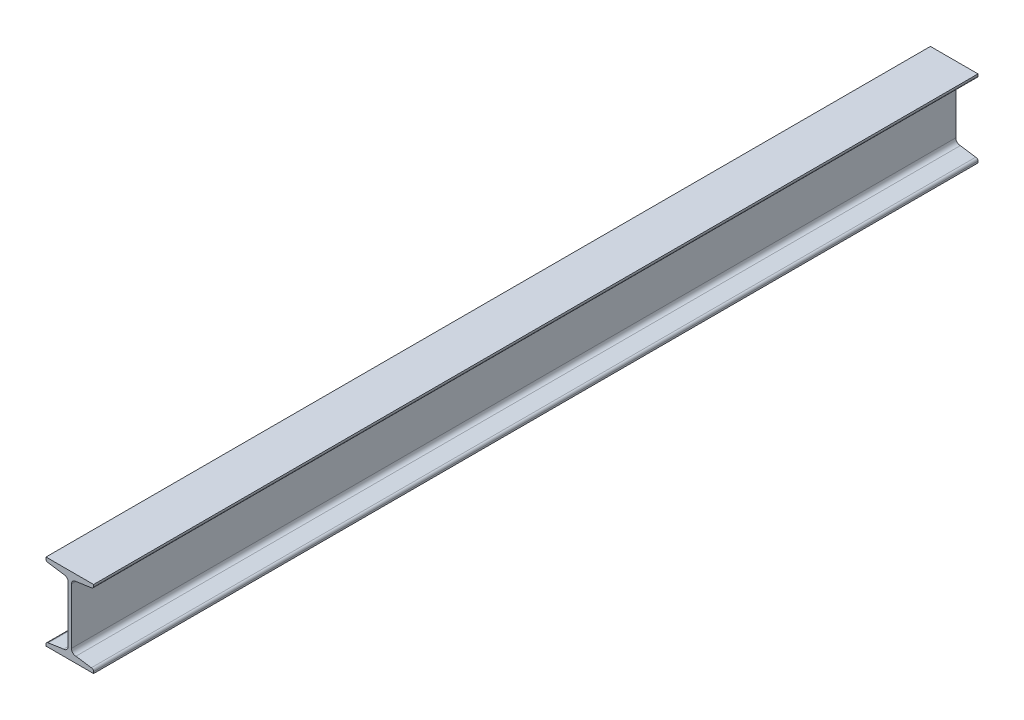
ISO-10303-21;
HEADER;
FILE_DESCRIPTION(('STEP AP214'),'2;1');
FILE_NAME('part.step','',(''),(''),'','','');
FILE_SCHEMA(('AUTOMOTIVE_DESIGN { 1 0 10303 214 1 1 1 1 }'));
ENDSEC;
DATA;
#1=APPLICATION_CONTEXT('core data for automotive mechanical design processes');
#2=APPLICATION_PROTOCOL_DEFINITION('international standard','automotive_design',2000,#1);
#3=PRODUCT_CONTEXT('',#1,'mechanical');
#4=PRODUCT('Part','Part','',(#3));
#5=PRODUCT_RELATED_PRODUCT_CATEGORY('part','',(#4));
#6=PRODUCT_DEFINITION_FORMATION('','',#4);
#7=PRODUCT_DEFINITION_CONTEXT('part definition',#1,'design');
#8=PRODUCT_DEFINITION('design','',#6,#7);
#9=PRODUCT_DEFINITION_SHAPE('','',#8);
#10=(LENGTH_UNIT() NAMED_UNIT(*) SI_UNIT(.MILLI.,.METRE.));
#11=(NAMED_UNIT(*) PLANE_ANGLE_UNIT() SI_UNIT($,.RADIAN.));
#12=(NAMED_UNIT(*) SI_UNIT($,.STERADIAN.) SOLID_ANGLE_UNIT());
#13=UNCERTAINTY_MEASURE_WITH_UNIT(LENGTH_MEASURE(1.E-05),#10,'distance_accuracy_value','');
#14=(GEOMETRIC_REPRESENTATION_CONTEXT(3) GLOBAL_UNCERTAINTY_ASSIGNED_CONTEXT((#13)) GLOBAL_UNIT_ASSIGNED_CONTEXT((#10,
#11,#12)) REPRESENTATION_CONTEXT('',''));
#15=CARTESIAN_POINT('',(0.,0.,0.));
#16=DIRECTION('',(0.,0.,1.));
#17=DIRECTION('',(1.,0.,0.));
#18=AXIS2_PLACEMENT_3D('',#15,#16,#17);
#19=CARTESIAN_POINT('',(-1.622623329756,10.8678027667378,687.5));
#20=DIRECTION('',(0.1476687011873,-0.989036882370752,0.));
#21=DIRECTION('',(0.989036882370752,0.1476687011873,0.));
#22=AXIS2_PLACEMENT_3D('',#19,#20,#21);
#23=PLANE('',#22);
#24=DIRECTION('',(0.,0.,-1.));
#25=VECTOR('',#24,1.);
#26=CARTESIAN_POINT('',(-33.5,6.10833333333334,687.5));
#27=LINE('',#26,#25);
#28=CARTESIAN_POINT('',(-33.5,6.10833333333334,687.5));
#29=VERTEX_POINT('',#28);
#30=CARTESIAN_POINT('',(-33.5,6.10833333333334,-687.5));
#31=VERTEX_POINT('',#30);
#32=EDGE_CURVE('E197',#29,#31,#27,.T.);
#33=ORIENTED_EDGE('',*,*,#32,.F.);
#34=DIRECTION('',(-0.989036882370752,-0.1476687011873,0.));
#35=VECTOR('',#34,1.);
#36=CARTESIAN_POINT('',(-9.5,9.69166666666667,687.5));
#37=LINE('',#36,#35);
#38=CARTESIAN_POINT('',(-9.5,9.69166666666667,687.5));
#39=VERTEX_POINT('',#38);
#40=EDGE_CURVE('E122',#39,#29,#37,.T.);
#41=ORIENTED_EDGE('',*,*,#40,.F.);
#42=DIRECTION('',(0.,0.,-1.));
#43=VECTOR('',#42,1.);
#44=CARTESIAN_POINT('',(-9.5,9.69166666666667,687.5));
#45=LINE('',#44,#43);
#46=CARTESIAN_POINT('',(-9.5,9.69166666666667,-687.5));
#47=VERTEX_POINT('',#46);
#48=EDGE_CURVE('E200',#39,#47,#45,.T.);
#49=ORIENTED_EDGE('',*,*,#48,.T.);
#50=DIRECTION('',(-0.989036882370752,-0.1476687011873,0.));
#51=VECTOR('',#50,1.);
#52=CARTESIAN_POINT('',(-9.5,9.69166666666667,-687.5));
#53=LINE('',#52,#51);
#54=EDGE_CURVE('E238',#47,#31,#53,.T.);
#55=ORIENTED_EDGE('',*,*,#54,.T.);
#56=EDGE_LOOP('',(#33,#41,#49,#55));
#57=FACE_BOUND('',#56,.T.);
#58=ADVANCED_FACE('F17',(#57),#23,.F.);
#59=CARTESIAN_POINT('',(-33.5,2.60833333333333,687.5));
#60=DIRECTION('',(0.,0.,-1.));
#61=DIRECTION('',(-1.,0.,0.));
#62=AXIS2_PLACEMENT_3D('',#59,#60,#61);
#63=CYLINDRICAL_SURFACE('',#62,3.5);
#64=CARTESIAN_POINT('',(-33.5,2.60833333333333,687.5));
#65=DIRECTION('',(0.,0.,-1.));
#66=DIRECTION('',(-1.,0.,0.));
#67=AXIS2_PLACEMENT_3D('',#64,#65,#66);
#68=CIRCLE('',#67,3.5);
#69=CARTESIAN_POINT('',(-37.,2.60833333333333,687.5));
#70=VERTEX_POINT('',#69);
#71=EDGE_CURVE('E123',#29,#70,#68,.F.);
#72=ORIENTED_EDGE('',*,*,#71,.F.);
#73=ORIENTED_EDGE('',*,*,#32,.T.);
#74=CARTESIAN_POINT('',(-33.5,2.60833333333333,-687.5));
#75=DIRECTION('',(0.,0.,-1.));
#76=DIRECTION('',(-1.,0.,0.));
#77=AXIS2_PLACEMENT_3D('',#74,#75,#76);
#78=CIRCLE('',#77,3.5);
#79=CARTESIAN_POINT('',(-37.,2.60833333333333,-687.5));
#80=VERTEX_POINT('',#79);
#81=EDGE_CURVE('E235',#31,#80,#78,.F.);
#82=ORIENTED_EDGE('',*,*,#81,.T.);
#83=DIRECTION('',(0.,0.,1.));
#84=VECTOR('',#83,1.);
#85=CARTESIAN_POINT('',(-37.,2.60833333333333,687.5));
#86=LINE('',#85,#84);
#87=EDGE_CURVE('E192',#70,#80,#86,.F.);
#88=ORIENTED_EDGE('',*,*,#87,.F.);
#89=EDGE_LOOP('',(#72,#73,#82,#88));
#90=FACE_BOUND('',#89,.T.);
#91=ADVANCED_FACE('F389',(#90),#63,.T.);
#92=CARTESIAN_POINT('',(-37.,0.,687.5));
#93=DIRECTION('',(-1.,0.,0.));
#94=DIRECTION('',(0.,0.,1.));
#95=AXIS2_PLACEMENT_3D('',#92,#93,#94);
#96=PLANE('',#95);
#97=DIRECTION('',(0.,1.,0.));
#98=VECTOR('',#97,1.);
#99=CARTESIAN_POINT('',(-37.,0.,687.5));
#100=LINE('',#99,#98);
#101=CARTESIAN_POINT('',(-37.,0.,687.5));
#102=VERTEX_POINT('',#101);
#103=EDGE_CURVE('E127',#70,#102,#100,.F.);
#104=ORIENTED_EDGE('',*,*,#103,.F.);
#105=ORIENTED_EDGE('',*,*,#87,.T.);
#106=DIRECTION('',(0.,1.,0.));
#107=VECTOR('',#106,1.);
#108=CARTESIAN_POINT('',(-37.,0.,-687.5));
#109=LINE('',#108,#107);
#110=CARTESIAN_POINT('',(-37.,0.,-687.5));
#111=VERTEX_POINT('',#110);
#112=EDGE_CURVE('E187',#80,#111,#109,.F.);
#113=ORIENTED_EDGE('',*,*,#112,.T.);
#114=DIRECTION('',(0.,0.,1.));
#115=VECTOR('',#114,1.);
#116=CARTESIAN_POINT('',(-37.,0.,687.5));
#117=LINE('',#116,#115);
#118=EDGE_CURVE('E180',#111,#102,#117,.T.);
#119=ORIENTED_EDGE('',*,*,#118,.T.);
#120=EDGE_LOOP('',(#104,#105,#113,#119));
#121=FACE_BOUND('',#120,.T.);
#122=ADVANCED_FACE('F270',(#121),#96,.T.);
#123=CARTESIAN_POINT('',(0.,0.,687.5));
#124=DIRECTION('',(0.,1.,0.));
#125=DIRECTION('',(0.,0.,1.));
#126=AXIS2_PLACEMENT_3D('',#123,#124,#125);
#127=PLANE('',#126);
#128=DIRECTION('',(0.,0.,1.));
#129=VECTOR('',#128,1.);
#130=CARTESIAN_POINT('',(37.,0.,687.5));
#131=LINE('',#130,#129);
#132=CARTESIAN_POINT('',(37.,0.,-687.5));
#133=VERTEX_POINT('',#132);
#134=CARTESIAN_POINT('',(37.,0.,687.5));
#135=VERTEX_POINT('',#134);
#136=EDGE_CURVE('E177',#133,#135,#131,.T.);
#137=ORIENTED_EDGE('',*,*,#136,.T.);
#138=DIRECTION('',(1.,0.,0.));
#139=VECTOR('',#138,1.);
#140=CARTESIAN_POINT('',(0.,0.,687.5));
#141=LINE('',#140,#139);
#142=EDGE_CURVE('E209',#102,#135,#141,.T.);
#143=ORIENTED_EDGE('',*,*,#142,.F.);
#144=ORIENTED_EDGE('',*,*,#118,.F.);
#145=DIRECTION('',(1.,0.,0.));
#146=VECTOR('',#145,1.);
#147=CARTESIAN_POINT('',(0.,0.,-687.5));
#148=LINE('',#147,#146);
#149=EDGE_CURVE('E183',#111,#133,#148,.T.);
#150=ORIENTED_EDGE('',*,*,#149,.T.);
#151=EDGE_LOOP('',(#137,#143,#144,#150));
#152=FACE_BOUND('',#151,.T.);
#153=ADVANCED_FACE('F275',(#152),#127,.F.);
#154=CARTESIAN_POINT('',(37.,0.,687.5));
#155=DIRECTION('',(-1.,0.,0.));
#156=DIRECTION('',(0.,0.,1.));
#157=AXIS2_PLACEMENT_3D('',#154,#155,#156);
#158=PLANE('',#157);
#159=DIRECTION('',(0.,0.,-1.));
#160=VECTOR('',#159,1.);
#161=CARTESIAN_POINT('',(37.,2.60833333333333,687.5));
#162=LINE('',#161,#160);
#163=CARTESIAN_POINT('',(37.,2.60833333333333,687.5));
#164=VERTEX_POINT('',#163);
#165=CARTESIAN_POINT('',(37.,2.60833333333333,-687.5));
#166=VERTEX_POINT('',#165);
#167=EDGE_CURVE('E174',#164,#166,#162,.T.);
#168=ORIENTED_EDGE('',*,*,#167,.F.);
#169=DIRECTION('',(0.,1.,0.));
#170=VECTOR('',#169,1.);
#171=CARTESIAN_POINT('',(37.,0.,687.5));
#172=LINE('',#171,#170);
#173=EDGE_CURVE('E212',#135,#164,#172,.T.);
#174=ORIENTED_EDGE('',*,*,#173,.F.);
#175=ORIENTED_EDGE('',*,*,#136,.F.);
#176=DIRECTION('',(0.,1.,0.));
#177=VECTOR('',#176,1.);
#178=CARTESIAN_POINT('',(37.,0.,-687.5));
#179=LINE('',#178,#177);
#180=EDGE_CURVE('E186',#133,#166,#179,.T.);
#181=ORIENTED_EDGE('',*,*,#180,.T.);
#182=EDGE_LOOP('',(#168,#174,#175,#181));
#183=FACE_BOUND('',#182,.T.);
#184=ADVANCED_FACE('F282',(#183),#158,.F.);
#185=CARTESIAN_POINT('',(33.5,2.60833333333333,687.5));
#186=DIRECTION('',(0.,0.,-1.));
#187=DIRECTION('',(-1.,0.,0.));
#188=AXIS2_PLACEMENT_3D('',#185,#186,#187);
#189=CYLINDRICAL_SURFACE('',#188,3.5);
#190=CARTESIAN_POINT('',(33.5,2.60833333333333,687.5));
#191=DIRECTION('',(0.,0.,-1.));
#192=DIRECTION('',(-1.,0.,0.));
#193=AXIS2_PLACEMENT_3D('',#190,#191,#192);
#194=CIRCLE('',#193,3.5);
#195=CARTESIAN_POINT('',(33.5,6.10833333333334,687.5));
#196=VERTEX_POINT('',#195);
#197=EDGE_CURVE('E251',#164,#196,#194,.F.);
#198=ORIENTED_EDGE('',*,*,#197,.F.);
#199=ORIENTED_EDGE('',*,*,#167,.T.);
#200=CARTESIAN_POINT('',(33.5,2.60833333333333,-687.5));
#201=DIRECTION('',(0.,0.,-1.));
#202=DIRECTION('',(-1.,0.,0.));
#203=AXIS2_PLACEMENT_3D('',#200,#201,#202);
#204=CIRCLE('',#203,3.5);
#205=CARTESIAN_POINT('',(33.5,6.10833333333334,-687.5));
#206=VERTEX_POINT('',#205);
#207=EDGE_CURVE('E232',#166,#206,#204,.F.);
#208=ORIENTED_EDGE('',*,*,#207,.T.);
#209=DIRECTION('',(0.,0.,1.));
#210=VECTOR('',#209,1.);
#211=CARTESIAN_POINT('',(33.5,6.10833333333333,687.5));
#212=LINE('',#211,#210);
#213=EDGE_CURVE('E171',#196,#206,#212,.F.);
#214=ORIENTED_EDGE('',*,*,#213,.F.);
#215=EDGE_LOOP('',(#198,#199,#208,#214));
#216=FACE_BOUND('',#215,.T.);
#217=ADVANCED_FACE('F286',(#216),#189,.T.);
#218=CARTESIAN_POINT('',(1.622623329756,10.8678027667378,687.5));
#219=DIRECTION('',(0.1476687011873,0.989036882370752,0.));
#220=DIRECTION('',(-0.989036882370752,0.1476687011873,0.));
#221=AXIS2_PLACEMENT_3D('',#218,#219,#220);
#222=PLANE('',#221);
#223=DIRECTION('',(-0.989036882370752,0.1476687011873,0.));
#224=VECTOR('',#223,1.);
#225=CARTESIAN_POINT('',(33.5,6.10833333333334,687.5));
#226=LINE('',#225,#224);
#227=CARTESIAN_POINT('',(9.5,9.69166666666667,687.5));
#228=VERTEX_POINT('',#227);
#229=EDGE_CURVE('E250',#196,#228,#226,.T.);
#230=ORIENTED_EDGE('',*,*,#229,.F.);
#231=ORIENTED_EDGE('',*,*,#213,.T.);
#232=DIRECTION('',(-0.989036882370752,0.1476687011873,0.));
#233=VECTOR('',#232,1.);
#234=CARTESIAN_POINT('',(33.5,6.10833333333334,-687.5));
#235=LINE('',#234,#233);
#236=CARTESIAN_POINT('',(9.5,9.69166666666667,-687.5));
#237=VERTEX_POINT('',#236);
#238=EDGE_CURVE('E231',#206,#237,#235,.T.);
#239=ORIENTED_EDGE('',*,*,#238,.T.);
#240=DIRECTION('',(0.,0.,-1.));
#241=VECTOR('',#240,1.);
#242=CARTESIAN_POINT('',(9.5,9.69166666666667,687.5));
#243=LINE('',#242,#241);
#244=EDGE_CURVE('E168',#237,#228,#243,.F.);
#245=ORIENTED_EDGE('',*,*,#244,.T.);
#246=EDGE_LOOP('',(#230,#231,#239,#245));
#247=FACE_BOUND('',#246,.T.);
#248=ADVANCED_FACE('F292',(#247),#222,.T.);
#249=CARTESIAN_POINT('',(9.5,16.6916666666666,687.5));
#250=DIRECTION('',(0.,0.,-1.));
#251=DIRECTION('',(-1.,0.,0.));
#252=AXIS2_PLACEMENT_3D('',#249,#250,#251);
#253=CYLINDRICAL_SURFACE('',#252,7.);
#254=DIRECTION('',(0.,0.,-1.));
#255=VECTOR('',#254,1.);
#256=CARTESIAN_POINT('',(2.5,16.6916666666666,687.5));
#257=LINE('',#256,#255);
#258=CARTESIAN_POINT('',(2.5,16.6916666666666,687.5));
#259=VERTEX_POINT('',#258);
#260=CARTESIAN_POINT('',(2.5,16.6916666666666,-687.5));
#261=VERTEX_POINT('',#260);
#262=EDGE_CURVE('E165',#259,#261,#257,.T.);
#263=ORIENTED_EDGE('',*,*,#262,.F.);
#264=CARTESIAN_POINT('',(9.5,16.6916666666666,687.5));
#265=DIRECTION('',(0.,0.,-1.));
#266=DIRECTION('',(-1.,0.,0.));
#267=AXIS2_PLACEMENT_3D('',#264,#265,#266);
#268=CIRCLE('',#267,7.);
#269=EDGE_CURVE('E248',#228,#259,#268,.T.);
#270=ORIENTED_EDGE('',*,*,#269,.F.);
#271=ORIENTED_EDGE('',*,*,#244,.F.);
#272=CARTESIAN_POINT('',(9.5,16.6916666666666,-687.5));
#273=DIRECTION('',(0.,0.,-1.));
#274=DIRECTION('',(-1.,0.,0.));
#275=AXIS2_PLACEMENT_3D('',#272,#273,#274);
#276=CIRCLE('',#275,7.);
#277=EDGE_CURVE('E228',#237,#261,#276,.T.);
#278=ORIENTED_EDGE('',*,*,#277,.T.);
#279=EDGE_LOOP('',(#263,#270,#271,#278));
#280=FACE_BOUND('',#279,.T.);
#281=ADVANCED_FACE('F298',(#280),#253,.F.);
#282=CARTESIAN_POINT('',(2.5,0.,687.5));
#283=DIRECTION('',(1.,0.,0.));
#284=DIRECTION('',(0.,0.,-1.));
#285=AXIS2_PLACEMENT_3D('',#282,#283,#284);
#286=PLANE('',#285);
#287=DIRECTION('',(0.,1.,0.));
#288=VECTOR('',#287,1.);
#289=CARTESIAN_POINT('',(2.5,0.,687.5));
#290=LINE('',#289,#288);
#291=CARTESIAN_POINT('',(2.5,103.308333333333,687.5));
#292=VERTEX_POINT('',#291);
#293=EDGE_CURVE('E247',#259,#292,#290,.T.);
#294=ORIENTED_EDGE('',*,*,#293,.F.);
#295=ORIENTED_EDGE('',*,*,#262,.T.);
#296=DIRECTION('',(0.,1.,0.));
#297=VECTOR('',#296,1.);
#298=CARTESIAN_POINT('',(2.5,0.,-687.5));
#299=LINE('',#298,#297);
#300=CARTESIAN_POINT('',(2.5,103.308333333333,-687.5));
#301=VERTEX_POINT('',#300);
#302=EDGE_CURVE('E227',#261,#301,#299,.T.);
#303=ORIENTED_EDGE('',*,*,#302,.T.);
#304=DIRECTION('',(0.,0.,-1.));
#305=VECTOR('',#304,1.);
#306=CARTESIAN_POINT('',(2.5,103.308333333333,687.5));
#307=LINE('',#306,#305);
#308=EDGE_CURVE('E162',#301,#292,#307,.F.);
#309=ORIENTED_EDGE('',*,*,#308,.T.);
#310=EDGE_LOOP('',(#294,#295,#303,#309));
#311=FACE_BOUND('',#310,.T.);
#312=ADVANCED_FACE('F304',(#311),#286,.T.);
#313=CARTESIAN_POINT('',(9.5,103.308333333333,687.5));
#314=DIRECTION('',(0.,0.,-1.));
#315=DIRECTION('',(-1.,0.,0.));
#316=AXIS2_PLACEMENT_3D('',#313,#314,#315);
#317=CYLINDRICAL_SURFACE('',#316,7.);
#318=DIRECTION('',(0.,0.,1.));
#319=VECTOR('',#318,1.);
#320=CARTESIAN_POINT('',(9.5,110.308333333333,687.5));
#321=LINE('',#320,#319);
#322=CARTESIAN_POINT('',(9.5,110.308333333333,-687.5));
#323=VERTEX_POINT('',#322);
#324=CARTESIAN_POINT('',(9.5,110.308333333333,687.5));
#325=VERTEX_POINT('',#324);
#326=EDGE_CURVE('E159',#323,#325,#321,.T.);
#327=ORIENTED_EDGE('',*,*,#326,.T.);
#328=CARTESIAN_POINT('',(9.5,103.308333333333,687.5));
#329=DIRECTION('',(0.,0.,-1.));
#330=DIRECTION('',(-1.,0.,0.));
#331=AXIS2_PLACEMENT_3D('',#328,#329,#330);
#332=CIRCLE('',#331,7.);
#333=EDGE_CURVE('E245',#292,#325,#332,.T.);
#334=ORIENTED_EDGE('',*,*,#333,.F.);
#335=ORIENTED_EDGE('',*,*,#308,.F.);
#336=CARTESIAN_POINT('',(9.5,103.308333333333,-687.5));
#337=DIRECTION('',(0.,0.,-1.));
#338=DIRECTION('',(-1.,0.,0.));
#339=AXIS2_PLACEMENT_3D('',#336,#337,#338);
#340=CIRCLE('',#339,7.);
#341=EDGE_CURVE('E224',#301,#323,#340,.T.);
#342=ORIENTED_EDGE('',*,*,#341,.T.);
#343=EDGE_LOOP('',(#327,#334,#335,#342));
#344=FACE_BOUND('',#343,.T.);
#345=ADVANCED_FACE('F437',(#344),#317,.F.);
#346=CARTESIAN_POINT('',(-15.903351691767,106.515471796021,687.5));
#347=DIRECTION('',(-0.1476687011873,0.989036882370752,0.));
#348=DIRECTION('',(-0.989036882370752,-0.1476687011873,0.));
#349=AXIS2_PLACEMENT_3D('',#346,#347,#348);
#350=PLANE('',#349);
#351=DIRECTION('',(0.,0.,-1.));
#352=VECTOR('',#351,1.);
#353=CARTESIAN_POINT('',(33.5,113.891666666667,687.5));
#354=LINE('',#353,#352);
#355=CARTESIAN_POINT('',(33.5,113.891666666667,687.5));
#356=VERTEX_POINT('',#355);
#357=CARTESIAN_POINT('',(33.5,113.891666666667,-687.5));
#358=VERTEX_POINT('',#357);
#359=EDGE_CURVE('E156',#356,#358,#354,.T.);
#360=ORIENTED_EDGE('',*,*,#359,.F.);
#361=DIRECTION('',(0.989036882370752,0.1476687011873,0.));
#362=VECTOR('',#361,1.);
#363=CARTESIAN_POINT('',(9.5,110.308333333333,687.5));
#364=LINE('',#363,#362);
#365=EDGE_CURVE('E244',#325,#356,#364,.T.);
#366=ORIENTED_EDGE('',*,*,#365,.F.);
#367=ORIENTED_EDGE('',*,*,#326,.F.);
#368=DIRECTION('',(0.989036882370752,0.1476687011873,0.));
#369=VECTOR('',#368,1.);
#370=CARTESIAN_POINT('',(9.5,110.308333333333,-687.5));
#371=LINE('',#370,#369);
#372=EDGE_CURVE('E223',#323,#358,#371,.T.);
#373=ORIENTED_EDGE('',*,*,#372,.T.);
#374=EDGE_LOOP('',(#360,#366,#367,#373));
#375=FACE_BOUND('',#374,.T.);
#376=ADVANCED_FACE('F433',(#375),#350,.F.);
#377=CARTESIAN_POINT('',(33.5,117.391666666667,687.5));
#378=DIRECTION('',(0.,0.,-1.));
#379=DIRECTION('',(-1.,0.,0.));
#380=AXIS2_PLACEMENT_3D('',#377,#378,#379);
#381=CYLINDRICAL_SURFACE('',#380,3.5);
#382=CARTESIAN_POINT('',(33.5,117.391666666667,687.5));
#383=DIRECTION('',(0.,0.,-1.));
#384=DIRECTION('',(-1.,0.,0.));
#385=AXIS2_PLACEMENT_3D('',#382,#383,#384);
#386=CIRCLE('',#385,3.5);
#387=CARTESIAN_POINT('',(37.,117.391666666667,687.5));
#388=VERTEX_POINT('',#387);
#389=EDGE_CURVE('E242',#356,#388,#386,.F.);
#390=ORIENTED_EDGE('',*,*,#389,.F.);
#391=ORIENTED_EDGE('',*,*,#359,.T.);
#392=CARTESIAN_POINT('',(33.5,117.391666666667,-687.5));
#393=DIRECTION('',(0.,0.,-1.));
#394=DIRECTION('',(-1.,0.,0.));
#395=AXIS2_PLACEMENT_3D('',#392,#393,#394);
#396=CIRCLE('',#395,3.5);
#397=CARTESIAN_POINT('',(37.,117.391666666667,-687.5));
#398=VERTEX_POINT('',#397);
#399=EDGE_CURVE('E220',#358,#398,#396,.F.);
#400=ORIENTED_EDGE('',*,*,#399,.T.);
#401=DIRECTION('',(0.,0.,-1.));
#402=VECTOR('',#401,1.);
#403=CARTESIAN_POINT('',(37.,117.391666666667,687.5));
#404=LINE('',#403,#402);
#405=EDGE_CURVE('E151',#388,#398,#404,.T.);
#406=ORIENTED_EDGE('',*,*,#405,.F.);
#407=EDGE_LOOP('',(#390,#391,#400,#406));
#408=FACE_BOUND('',#407,.T.);
#409=ADVANCED_FACE('F430',(#408),#381,.T.);
#410=CARTESIAN_POINT('',(37.,0.,687.5));
#411=DIRECTION('',(1.,0.,0.));
#412=DIRECTION('',(0.,0.,-1.));
#413=AXIS2_PLACEMENT_3D('',#410,#411,#412);
#414=PLANE('',#413);
#415=DIRECTION('',(0.,1.,0.));
#416=VECTOR('',#415,1.);
#417=CARTESIAN_POINT('',(37.,0.,687.5));
#418=LINE('',#417,#416);
#419=CARTESIAN_POINT('',(37.,120.,687.5));
#420=VERTEX_POINT('',#419);
#421=EDGE_CURVE('E206',#388,#420,#418,.T.);
#422=ORIENTED_EDGE('',*,*,#421,.F.);
#423=ORIENTED_EDGE('',*,*,#405,.T.);
#424=DIRECTION('',(0.,1.,0.));
#425=VECTOR('',#424,1.);
#426=CARTESIAN_POINT('',(37.,0.,-687.5));
#427=LINE('',#426,#425);
#428=CARTESIAN_POINT('',(37.,120.,-687.5));
#429=VERTEX_POINT('',#428);
#430=EDGE_CURVE('E146',#398,#429,#427,.T.);
#431=ORIENTED_EDGE('',*,*,#430,.T.);
#432=DIRECTION('',(0.,0.,1.));
#433=VECTOR('',#432,1.);
#434=CARTESIAN_POINT('',(37.,120.,687.5));
#435=LINE('',#434,#433);
#436=EDGE_CURVE('E139',#420,#429,#435,.F.);
#437=ORIENTED_EDGE('',*,*,#436,.F.);
#438=EDGE_LOOP('',(#422,#423,#431,#437));
#439=FACE_BOUND('',#438,.T.);
#440=ADVANCED_FACE('F365',(#439),#414,.T.);
#441=CARTESIAN_POINT('',(0.,120.,687.5));
#442=DIRECTION('',(0.,1.,0.));
#443=DIRECTION('',(0.,0.,1.));
#444=AXIS2_PLACEMENT_3D('',#441,#442,#443);
#445=PLANE('',#444);
#446=DIRECTION('',(1.,0.,0.));
#447=VECTOR('',#446,1.);
#448=CARTESIAN_POINT('',(0.,120.,687.5));
#449=LINE('',#448,#447);
#450=CARTESIAN_POINT('',(-37.,120.,687.5));
#451=VERTEX_POINT('',#450);
#452=EDGE_CURVE('E202',#420,#451,#449,.F.);
#453=ORIENTED_EDGE('',*,*,#452,.F.);
#454=ORIENTED_EDGE('',*,*,#436,.T.);
#455=DIRECTION('',(1.,0.,0.));
#456=VECTOR('',#455,1.);
#457=CARTESIAN_POINT('',(0.,120.,-687.5));
#458=LINE('',#457,#456);
#459=CARTESIAN_POINT('',(-37.,120.,-687.5));
#460=VERTEX_POINT('',#459);
#461=EDGE_CURVE('E142',#429,#460,#458,.F.);
#462=ORIENTED_EDGE('',*,*,#461,.T.);
#463=DIRECTION('',(0.,0.,-1.));
#464=VECTOR('',#463,1.);
#465=CARTESIAN_POINT('',(-37.,120.,687.5));
#466=LINE('',#465,#464);
#467=EDGE_CURVE('E136',#460,#451,#466,.F.);
#468=ORIENTED_EDGE('',*,*,#467,.T.);
#469=EDGE_LOOP('',(#453,#454,#462,#468));
#470=FACE_BOUND('',#469,.T.);
#471=ADVANCED_FACE('F359',(#470),#445,.T.);
#472=CARTESIAN_POINT('',(-37.,0.,687.5));
#473=DIRECTION('',(1.,0.,0.));
#474=DIRECTION('',(0.,0.,-1.));
#475=AXIS2_PLACEMENT_3D('',#472,#473,#474);
#476=PLANE('',#475);
#477=DIRECTION('',(0.,0.,-1.));
#478=VECTOR('',#477,1.);
#479=CARTESIAN_POINT('',(-37.,117.391666666667,687.5));
#480=LINE('',#479,#478);
#481=CARTESIAN_POINT('',(-37.,117.391666666667,687.5));
#482=VERTEX_POINT('',#481);
#483=CARTESIAN_POINT('',(-37.,117.391666666667,-687.5));
#484=VERTEX_POINT('',#483);
#485=EDGE_CURVE('E133',#482,#484,#480,.T.);
#486=ORIENTED_EDGE('',*,*,#485,.F.);
#487=DIRECTION('',(0.,1.,0.));
#488=VECTOR('',#487,1.);
#489=CARTESIAN_POINT('',(-37.,0.,687.5));
#490=LINE('',#489,#488);
#491=EDGE_CURVE('E205',#451,#482,#490,.F.);
#492=ORIENTED_EDGE('',*,*,#491,.F.);
#493=ORIENTED_EDGE('',*,*,#467,.F.);
#494=DIRECTION('',(0.,1.,0.));
#495=VECTOR('',#494,1.);
#496=CARTESIAN_POINT('',(-37.,0.,-687.5));
#497=LINE('',#496,#495);
#498=EDGE_CURVE('E145',#460,#484,#497,.F.);
#499=ORIENTED_EDGE('',*,*,#498,.T.);
#500=EDGE_LOOP('',(#486,#492,#493,#499));
#501=FACE_BOUND('',#500,.T.);
#502=ADVANCED_FACE('F346',(#501),#476,.F.);
#503=CARTESIAN_POINT('',(-33.5,117.391666666667,687.5));
#504=DIRECTION('',(0.,0.,-1.));
#505=DIRECTION('',(-1.,0.,0.));
#506=AXIS2_PLACEMENT_3D('',#503,#504,#505);
#507=CYLINDRICAL_SURFACE('',#506,3.5);
#508=CARTESIAN_POINT('',(-33.5,117.391666666667,687.5));
#509=DIRECTION('',(0.,0.,-1.));
#510=DIRECTION('',(-1.,0.,0.));
#511=AXIS2_PLACEMENT_3D('',#508,#509,#510);
#512=CIRCLE('',#511,3.5);
#513=CARTESIAN_POINT('',(-33.5,113.891666666667,687.5));
#514=VERTEX_POINT('',#513);
#515=EDGE_CURVE('E114',#482,#514,#512,.F.);
#516=ORIENTED_EDGE('',*,*,#515,.F.);
#517=ORIENTED_EDGE('',*,*,#485,.T.);
#518=CARTESIAN_POINT('',(-33.5,117.391666666667,-687.5));
#519=DIRECTION('',(0.,0.,-1.));
#520=DIRECTION('',(-1.,0.,0.));
#521=AXIS2_PLACEMENT_3D('',#518,#519,#520);
#522=CIRCLE('',#521,3.5);
#523=CARTESIAN_POINT('',(-33.5,113.891666666667,-687.5));
#524=VERTEX_POINT('',#523);
#525=EDGE_CURVE('E217',#484,#524,#522,.F.);
#526=ORIENTED_EDGE('',*,*,#525,.T.);
#527=DIRECTION('',(0.,0.,1.));
#528=VECTOR('',#527,1.);
#529=CARTESIAN_POINT('',(-33.5,113.891666666667,687.5));
#530=LINE('',#529,#528);
#531=EDGE_CURVE('E106',#514,#524,#530,.F.);
#532=ORIENTED_EDGE('',*,*,#531,.F.);
#533=EDGE_LOOP('',(#516,#517,#526,#532));
#534=FACE_BOUND('',#533,.T.);
#535=ADVANCED_FACE('F420',(#534),#507,.T.);
#536=CARTESIAN_POINT('',(15.903351691767,106.515471796021,687.5));
#537=DIRECTION('',(-0.1476687011873,-0.989036882370752,0.));
#538=DIRECTION('',(0.989036882370752,-0.1476687011873,0.));
#539=AXIS2_PLACEMENT_3D('',#536,#537,#538);
#540=PLANE('',#539);
#541=DIRECTION('',(0.989036882370752,-0.1476687011873,0.));
#542=VECTOR('',#541,1.);
#543=CARTESIAN_POINT('',(-33.5,113.891666666667,687.5));
#544=LINE('',#543,#542);
#545=CARTESIAN_POINT('',(-9.5,110.308333333333,687.5));
#546=VERTEX_POINT('',#545);
#547=EDGE_CURVE('E98',#514,#546,#544,.T.);
#548=ORIENTED_EDGE('',*,*,#547,.F.);
#549=ORIENTED_EDGE('',*,*,#531,.T.);
#550=DIRECTION('',(0.989036882370752,-0.1476687011873,0.));
#551=VECTOR('',#550,1.);
#552=CARTESIAN_POINT('',(-33.5,113.891666666667,-687.5));
#553=LINE('',#552,#551);
#554=CARTESIAN_POINT('',(-9.5,110.308333333333,-687.5));
#555=VERTEX_POINT('',#554);
#556=EDGE_CURVE('E101',#524,#555,#553,.T.);
#557=ORIENTED_EDGE('',*,*,#556,.T.);
#558=DIRECTION('',(0.,0.,-1.));
#559=VECTOR('',#558,1.);
#560=CARTESIAN_POINT('',(-9.5,110.308333333333,687.5));
#561=LINE('',#560,#559);
#562=EDGE_CURVE('E94',#555,#546,#561,.F.);
#563=ORIENTED_EDGE('',*,*,#562,.T.);
#564=EDGE_LOOP('',(#548,#549,#557,#563));
#565=FACE_BOUND('',#564,.T.);
#566=ADVANCED_FACE('F96',(#565),#540,.T.);
#567=CARTESIAN_POINT('',(-9.5,103.308333333333,687.5));
#568=DIRECTION('',(0.,0.,-1.));
#569=DIRECTION('',(-1.,0.,0.));
#570=AXIS2_PLACEMENT_3D('',#567,#568,#569);
#571=CYLINDRICAL_SURFACE('',#570,7.);
#572=DIRECTION('',(0.,0.,-1.));
#573=VECTOR('',#572,1.);
#574=CARTESIAN_POINT('',(-2.5,103.308333333333,687.5));
#575=LINE('',#574,#573);
#576=CARTESIAN_POINT('',(-2.5,103.308333333333,-687.5));
#577=VERTEX_POINT('',#576);
#578=CARTESIAN_POINT('',(-2.5,103.308333333333,687.5));
#579=VERTEX_POINT('',#578);
#580=EDGE_CURVE('E121',#577,#579,#575,.F.);
#581=ORIENTED_EDGE('',*,*,#580,.T.);
#582=CARTESIAN_POINT('',(-9.5,103.308333333333,687.5));
#583=DIRECTION('',(0.,0.,-1.));
#584=DIRECTION('',(-1.,0.,0.));
#585=AXIS2_PLACEMENT_3D('',#582,#583,#584);
#586=CIRCLE('',#585,7.);
#587=EDGE_CURVE('E20',#546,#579,#586,.T.);
#588=ORIENTED_EDGE('',*,*,#587,.F.);
#589=ORIENTED_EDGE('',*,*,#562,.F.);
#590=CARTESIAN_POINT('',(-9.5,103.308333333333,-687.5));
#591=DIRECTION('',(0.,0.,-1.));
#592=DIRECTION('',(-1.,0.,0.));
#593=AXIS2_PLACEMENT_3D('',#590,#591,#592);
#594=CIRCLE('',#593,7.);
#595=EDGE_CURVE('E215',#555,#577,#594,.T.);
#596=ORIENTED_EDGE('',*,*,#595,.T.);
#597=EDGE_LOOP('',(#581,#588,#589,#596));
#598=FACE_BOUND('',#597,.T.);
#599=ADVANCED_FACE('F119',(#598),#571,.F.);
#600=CARTESIAN_POINT('',(0.,0.,687.5));
#601=DIRECTION('',(0.,0.,1.));
#602=DIRECTION('',(1.,0.,0.));
#603=AXIS2_PLACEMENT_3D('',#600,#601,#602);
#604=PLANE('',#603);
#605=ORIENTED_EDGE('',*,*,#515,.T.);
#606=ORIENTED_EDGE('',*,*,#547,.T.);
#607=ORIENTED_EDGE('',*,*,#587,.T.);
#608=DIRECTION('',(0.,1.,0.));
#609=VECTOR('',#608,1.);
#610=CARTESIAN_POINT('',(-2.5,0.,687.5));
#611=LINE('',#610,#609);
#612=CARTESIAN_POINT('',(-2.5,16.6916666666666,687.5));
#613=VERTEX_POINT('',#612);
#614=EDGE_CURVE('E316',#579,#613,#611,.F.);
#615=ORIENTED_EDGE('',*,*,#614,.T.);
#616=CARTESIAN_POINT('',(-9.5,16.6916666666666,687.5));
#617=DIRECTION('',(0.,0.,-1.));
#618=DIRECTION('',(-1.,0.,0.));
#619=AXIS2_PLACEMENT_3D('',#616,#617,#618);
#620=CIRCLE('',#619,7.);
#621=EDGE_CURVE('E116',#613,#39,#620,.T.);
#622=ORIENTED_EDGE('',*,*,#621,.T.);
#623=ORIENTED_EDGE('',*,*,#40,.T.);
#624=ORIENTED_EDGE('',*,*,#71,.T.);
#625=ORIENTED_EDGE('',*,*,#103,.T.);
#626=ORIENTED_EDGE('',*,*,#142,.T.);
#627=ORIENTED_EDGE('',*,*,#173,.T.);
#628=ORIENTED_EDGE('',*,*,#197,.T.);
#629=ORIENTED_EDGE('',*,*,#229,.T.);
#630=ORIENTED_EDGE('',*,*,#269,.T.);
#631=ORIENTED_EDGE('',*,*,#293,.T.);
#632=ORIENTED_EDGE('',*,*,#333,.T.);
#633=ORIENTED_EDGE('',*,*,#365,.T.);
#634=ORIENTED_EDGE('',*,*,#389,.T.);
#635=ORIENTED_EDGE('',*,*,#421,.T.);
#636=ORIENTED_EDGE('',*,*,#452,.T.);
#637=ORIENTED_EDGE('',*,*,#491,.T.);
#638=EDGE_LOOP('',(#605,#606,#607,#615,#622,#623,#624,#625,#626,#627,#628,#629,#630,#631,#632,
#633,#634,#635,#636,#637));
#639=FACE_BOUND('',#638,.T.);
#640=ADVANCED_FACE('F110',(#639),#604,.T.);
#641=CARTESIAN_POINT('',(-9.5,16.6916666666666,687.5));
#642=DIRECTION('',(0.,0.,-1.));
#643=DIRECTION('',(-1.,0.,0.));
#644=AXIS2_PLACEMENT_3D('',#641,#642,#643);
#645=CYLINDRICAL_SURFACE('',#644,7.);
#646=ORIENTED_EDGE('',*,*,#48,.F.);
#647=ORIENTED_EDGE('',*,*,#621,.F.);
#648=DIRECTION('',(0.,0.,-1.));
#649=VECTOR('',#648,1.);
#650=CARTESIAN_POINT('',(-2.5,16.6916666666666,687.5));
#651=LINE('',#650,#649);
#652=CARTESIAN_POINT('',(-2.5,16.6916666666666,-687.5));
#653=VERTEX_POINT('',#652);
#654=EDGE_CURVE('E26',#613,#653,#651,.T.);
#655=ORIENTED_EDGE('',*,*,#654,.T.);
#656=CARTESIAN_POINT('',(-9.5,16.6916666666666,-687.5));
#657=DIRECTION('',(0.,0.,-1.));
#658=DIRECTION('',(-1.,0.,0.));
#659=AXIS2_PLACEMENT_3D('',#656,#657,#658);
#660=CIRCLE('',#659,7.);
#661=EDGE_CURVE('E34',#653,#47,#660,.T.);
#662=ORIENTED_EDGE('',*,*,#661,.T.);
#663=EDGE_LOOP('',(#646,#647,#655,#662));
#664=FACE_BOUND('',#663,.T.);
#665=ADVANCED_FACE('F407',(#664),#645,.F.);
#666=CARTESIAN_POINT('',(0.,0.,-687.5));
#667=DIRECTION('',(0.,0.,1.));
#668=DIRECTION('',(1.,0.,0.));
#669=AXIS2_PLACEMENT_3D('',#666,#667,#668);
#670=PLANE('',#669);
#671=ORIENTED_EDGE('',*,*,#556,.F.);
#672=ORIENTED_EDGE('',*,*,#525,.F.);
#673=ORIENTED_EDGE('',*,*,#498,.F.);
#674=ORIENTED_EDGE('',*,*,#461,.F.);
#675=ORIENTED_EDGE('',*,*,#430,.F.);
#676=ORIENTED_EDGE('',*,*,#399,.F.);
#677=ORIENTED_EDGE('',*,*,#372,.F.);
#678=ORIENTED_EDGE('',*,*,#341,.F.);
#679=ORIENTED_EDGE('',*,*,#302,.F.);
#680=ORIENTED_EDGE('',*,*,#277,.F.);
#681=ORIENTED_EDGE('',*,*,#238,.F.);
#682=ORIENTED_EDGE('',*,*,#207,.F.);
#683=ORIENTED_EDGE('',*,*,#180,.F.);
#684=ORIENTED_EDGE('',*,*,#149,.F.);
#685=ORIENTED_EDGE('',*,*,#112,.F.);
#686=ORIENTED_EDGE('',*,*,#81,.F.);
#687=ORIENTED_EDGE('',*,*,#54,.F.);
#688=ORIENTED_EDGE('',*,*,#661,.F.);
#689=DIRECTION('',(0.,1.,0.));
#690=VECTOR('',#689,1.);
#691=CARTESIAN_POINT('',(-2.5,0.,-687.5));
#692=LINE('',#691,#690);
#693=EDGE_CURVE('E11',#653,#577,#692,.T.);
#694=ORIENTED_EDGE('',*,*,#693,.T.);
#695=ORIENTED_EDGE('',*,*,#595,.F.);
#696=EDGE_LOOP('',(#671,#672,#673,#674,#675,#676,#677,#678,#679,#680,#681,#682,#683,#684,#685,
#686,#687,#688,#694,#695));
#697=FACE_BOUND('',#696,.T.);
#698=ADVANCED_FACE('F353',(#697),#670,.F.);
#699=CARTESIAN_POINT('',(-2.5,0.,687.5));
#700=DIRECTION('',(1.,0.,0.));
#701=DIRECTION('',(0.,0.,-1.));
#702=AXIS2_PLACEMENT_3D('',#699,#700,#701);
#703=PLANE('',#702);
#704=ORIENTED_EDGE('',*,*,#654,.F.);
#705=ORIENTED_EDGE('',*,*,#614,.F.);
#706=ORIENTED_EDGE('',*,*,#580,.F.);
#707=ORIENTED_EDGE('',*,*,#693,.F.);
#708=EDGE_LOOP('',(#704,#705,#706,#707));
#709=FACE_BOUND('',#708,.T.);
#710=ADVANCED_FACE('F399',(#709),#703,.F.);
#711=CLOSED_SHELL('',(#58,#91,#122,#153,#184,#217,#248,#281,#312,#345,#376,#409,#440,#471,#502,
#535,#566,#599,#640,#665,#698,#710));
#712=MANIFOLD_SOLID_BREP('B1',#711);
#713=ADVANCED_BREP_SHAPE_REPRESENTATION('',(#18,#712),#14);
#714=SHAPE_DEFINITION_REPRESENTATION(#9,#713);
ENDSEC;
END-ISO-10303-21;
